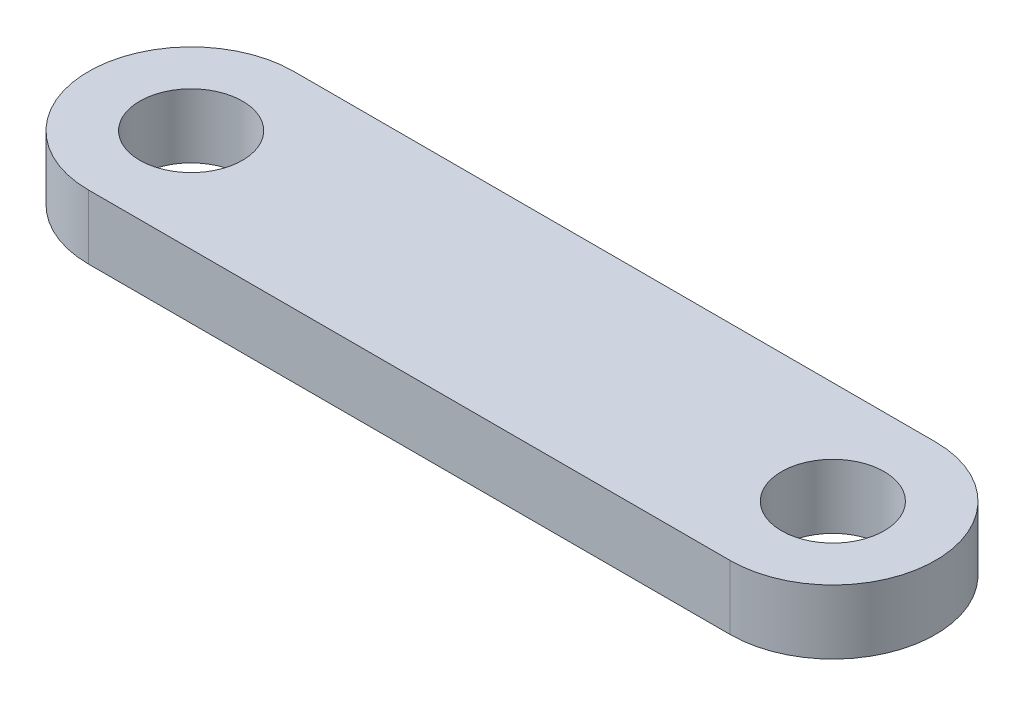
ISO-10303-21;
HEADER;
FILE_DESCRIPTION(('STEP AP214'),'2;1');
FILE_NAME('part.step','',(''),(''),'','','');
FILE_SCHEMA(('AUTOMOTIVE_DESIGN { 1 0 10303 214 1 1 1 1 }'));
ENDSEC;
DATA;
#1=APPLICATION_CONTEXT('core data for automotive mechanical design processes');
#2=APPLICATION_PROTOCOL_DEFINITION('international standard','automotive_design',2000,#1);
#3=PRODUCT_CONTEXT('',#1,'mechanical');
#4=PRODUCT('Part','Part','',(#3));
#5=PRODUCT_RELATED_PRODUCT_CATEGORY('part','',(#4));
#6=PRODUCT_DEFINITION_FORMATION('','',#4);
#7=PRODUCT_DEFINITION_CONTEXT('part definition',#1,'design');
#8=PRODUCT_DEFINITION('design','',#6,#7);
#9=PRODUCT_DEFINITION_SHAPE('','',#8);
#10=(LENGTH_UNIT() NAMED_UNIT(*) SI_UNIT(.MILLI.,.METRE.));
#11=(NAMED_UNIT(*) PLANE_ANGLE_UNIT() SI_UNIT($,.RADIAN.));
#12=(NAMED_UNIT(*) SI_UNIT($,.STERADIAN.) SOLID_ANGLE_UNIT());
#13=UNCERTAINTY_MEASURE_WITH_UNIT(LENGTH_MEASURE(1.E-05),#10,'distance_accuracy_value','');
#14=(GEOMETRIC_REPRESENTATION_CONTEXT(3) GLOBAL_UNCERTAINTY_ASSIGNED_CONTEXT((#13)) GLOBAL_UNIT_ASSIGNED_CONTEXT((#10,
#11,#12)) REPRESENTATION_CONTEXT('',''));
#15=CARTESIAN_POINT('',(0.,0.,0.));
#16=DIRECTION('',(0.,0.,1.));
#17=DIRECTION('',(1.,0.,0.));
#18=AXIS2_PLACEMENT_3D('',#15,#16,#17);
#19=CARTESIAN_POINT('',(25.,5.,0.));
#20=DIRECTION('',(0.,-1.,0.));
#21=DIRECTION('',(0.,0.,-1.));
#22=AXIS2_PLACEMENT_3D('',#19,#20,#21);
#23=PLANE('',#22);
#24=CARTESIAN_POINT('',(25.,5.,0.));
#25=DIRECTION('',(0.,1.,0.));
#26=DIRECTION('',(0.,0.,-1.));
#27=AXIS2_PLACEMENT_3D('',#24,#25,#26);
#28=CIRCLE('',#27,8.);
#29=CARTESIAN_POINT('',(25.,5.,8.));
#30=VERTEX_POINT('',#29);
#31=CARTESIAN_POINT('',(25.,5.,-8.));
#32=VERTEX_POINT('',#31);
#33=EDGE_CURVE('E84',#30,#32,#28,.T.);
#34=ORIENTED_EDGE('',*,*,#33,.T.);
#35=DIRECTION('',(-1.,0.,0.));
#36=VECTOR('',#35,1.);
#37=CARTESIAN_POINT('',(-25.,5.,-8.));
#38=LINE('',#37,#36);
#39=CARTESIAN_POINT('',(-25.,5.,-8.));
#40=VERTEX_POINT('',#39);
#41=EDGE_CURVE('E79',#32,#40,#38,.T.);
#42=ORIENTED_EDGE('',*,*,#41,.T.);
#43=CARTESIAN_POINT('',(-25.,5.,0.));
#44=DIRECTION('',(0.,1.,0.));
#45=DIRECTION('',(0.,0.,1.));
#46=AXIS2_PLACEMENT_3D('',#43,#44,#45);
#47=CIRCLE('',#46,8.);
#48=CARTESIAN_POINT('',(-25.,5.,8.));
#49=VERTEX_POINT('',#48);
#50=EDGE_CURVE('E82',#40,#49,#47,.T.);
#51=ORIENTED_EDGE('',*,*,#50,.T.);
#52=DIRECTION('',(1.,0.,0.));
#53=VECTOR('',#52,1.);
#54=CARTESIAN_POINT('',(-25.,5.,8.));
#55=LINE('',#54,#53);
#56=EDGE_CURVE('E49',#49,#30,#55,.T.);
#57=ORIENTED_EDGE('',*,*,#56,.T.);
#58=EDGE_LOOP('',(#34,#42,#51,#57));
#59=FACE_BOUND('',#58,.T.);
#60=CARTESIAN_POINT('',(-25.,5.,0.));
#61=DIRECTION('',(0.,1.,0.));
#62=DIRECTION('',(0.,0.,1.));
#63=AXIS2_PLACEMENT_3D('',#60,#61,#62);
#64=CIRCLE('',#63,4.);
#65=CARTESIAN_POINT('',(-25.,5.,4.));
#66=VERTEX_POINT('',#65);
#67=EDGE_CURVE('E99',#66,#66,#64,.T.);
#68=ORIENTED_EDGE('',*,*,#67,.F.);
#69=EDGE_LOOP('',(#68));
#70=FACE_BOUND('',#69,.T.);
#71=CARTESIAN_POINT('',(25.,5.,0.));
#72=DIRECTION('',(0.,1.,0.));
#73=DIRECTION('',(0.,0.,1.));
#74=AXIS2_PLACEMENT_3D('',#71,#72,#73);
#75=CIRCLE('',#74,4.);
#76=CARTESIAN_POINT('',(25.,5.,4.));
#77=VERTEX_POINT('',#76);
#78=EDGE_CURVE('E114',#77,#77,#75,.T.);
#79=ORIENTED_EDGE('',*,*,#78,.F.);
#80=EDGE_LOOP('',(#79));
#81=FACE_BOUND('',#80,.T.);
#82=ADVANCED_FACE('F32',(#59,#70,#81),#23,.F.);
#83=CARTESIAN_POINT('',(25.,0.,0.));
#84=DIRECTION('',(0.,-1.,0.));
#85=DIRECTION('',(0.,0.,-1.));
#86=AXIS2_PLACEMENT_3D('',#83,#84,#85);
#87=PLANE('',#86);
#88=CARTESIAN_POINT('',(-25.,0.,0.));
#89=DIRECTION('',(0.,1.,0.));
#90=DIRECTION('',(0.,0.,1.));
#91=AXIS2_PLACEMENT_3D('',#88,#89,#90);
#92=CIRCLE('',#91,4.);
#93=CARTESIAN_POINT('',(-25.,0.,4.));
#94=VERTEX_POINT('',#93);
#95=EDGE_CURVE('E111',#94,#94,#92,.T.);
#96=ORIENTED_EDGE('',*,*,#95,.T.);
#97=EDGE_LOOP('',(#96));
#98=FACE_BOUND('',#97,.T.);
#99=CARTESIAN_POINT('',(25.,0.,0.));
#100=DIRECTION('',(0.,1.,0.));
#101=DIRECTION('',(0.,0.,-1.));
#102=AXIS2_PLACEMENT_3D('',#99,#100,#101);
#103=CIRCLE('',#102,8.);
#104=CARTESIAN_POINT('',(25.,0.,8.));
#105=VERTEX_POINT('',#104);
#106=CARTESIAN_POINT('',(25.,0.,-8.));
#107=VERTEX_POINT('',#106);
#108=EDGE_CURVE('E96',#105,#107,#103,.T.);
#109=ORIENTED_EDGE('',*,*,#108,.F.);
#110=DIRECTION('',(1.,0.,0.));
#111=VECTOR('',#110,1.);
#112=CARTESIAN_POINT('',(-25.,0.,8.));
#113=LINE('',#112,#111);
#114=CARTESIAN_POINT('',(-25.,0.,8.));
#115=VERTEX_POINT('',#114);
#116=EDGE_CURVE('E72',#115,#105,#113,.T.);
#117=ORIENTED_EDGE('',*,*,#116,.F.);
#118=CARTESIAN_POINT('',(-25.,0.,0.));
#119=DIRECTION('',(0.,1.,0.));
#120=DIRECTION('',(0.,0.,1.));
#121=AXIS2_PLACEMENT_3D('',#118,#119,#120);
#122=CIRCLE('',#121,8.);
#123=CARTESIAN_POINT('',(-25.,0.,-8.));
#124=VERTEX_POINT('',#123);
#125=EDGE_CURVE('E66',#124,#115,#122,.T.);
#126=ORIENTED_EDGE('',*,*,#125,.F.);
#127=DIRECTION('',(-1.,0.,0.));
#128=VECTOR('',#127,1.);
#129=CARTESIAN_POINT('',(-25.,0.,-8.));
#130=LINE('',#129,#128);
#131=EDGE_CURVE('E88',#107,#124,#130,.T.);
#132=ORIENTED_EDGE('',*,*,#131,.F.);
#133=EDGE_LOOP('',(#109,#117,#126,#132));
#134=FACE_BOUND('',#133,.T.);
#135=CARTESIAN_POINT('',(25.,0.,0.));
#136=DIRECTION('',(0.,1.,0.));
#137=DIRECTION('',(0.,0.,1.));
#138=AXIS2_PLACEMENT_3D('',#135,#136,#137);
#139=CIRCLE('',#138,4.);
#140=CARTESIAN_POINT('',(25.,0.,4.));
#141=VERTEX_POINT('',#140);
#142=EDGE_CURVE('E117',#141,#141,#139,.T.);
#143=ORIENTED_EDGE('',*,*,#142,.T.);
#144=EDGE_LOOP('',(#143));
#145=FACE_BOUND('',#144,.T.);
#146=ADVANCED_FACE('F107',(#98,#134,#145),#87,.T.);
#147=CARTESIAN_POINT('',(25.,5.,0.));
#148=DIRECTION('',(0.,-1.,0.));
#149=DIRECTION('',(0.,0.,-1.));
#150=AXIS2_PLACEMENT_3D('',#147,#148,#149);
#151=CYLINDRICAL_SURFACE('',#150,8.);
#152=ORIENTED_EDGE('',*,*,#108,.T.);
#153=DIRECTION('',(0.,-1.,0.));
#154=VECTOR('',#153,1.);
#155=CARTESIAN_POINT('',(25.,5.,-8.));
#156=LINE('',#155,#154);
#157=EDGE_CURVE('E11',#32,#107,#156,.T.);
#158=ORIENTED_EDGE('',*,*,#157,.F.);
#159=ORIENTED_EDGE('',*,*,#33,.F.);
#160=DIRECTION('',(0.,-1.,0.));
#161=VECTOR('',#160,1.);
#162=CARTESIAN_POINT('',(25.,5.,8.));
#163=LINE('',#162,#161);
#164=EDGE_CURVE('E92',#30,#105,#163,.T.);
#165=ORIENTED_EDGE('',*,*,#164,.T.);
#166=EDGE_LOOP('',(#152,#158,#159,#165));
#167=FACE_BOUND('',#166,.T.);
#168=ADVANCED_FACE('F34',(#167),#151,.T.);
#169=CARTESIAN_POINT('',(-25.,5.,-8.));
#170=DIRECTION('',(0.,0.,1.));
#171=DIRECTION('',(1.,0.,0.));
#172=AXIS2_PLACEMENT_3D('',#169,#170,#171);
#173=PLANE('',#172);
#174=ORIENTED_EDGE('',*,*,#131,.T.);
#175=DIRECTION('',(0.,-1.,0.));
#176=VECTOR('',#175,1.);
#177=CARTESIAN_POINT('',(-25.,5.,-8.));
#178=LINE('',#177,#176);
#179=EDGE_CURVE('E41',#40,#124,#178,.T.);
#180=ORIENTED_EDGE('',*,*,#179,.F.);
#181=ORIENTED_EDGE('',*,*,#41,.F.);
#182=ORIENTED_EDGE('',*,*,#157,.T.);
#183=EDGE_LOOP('',(#174,#180,#181,#182));
#184=FACE_BOUND('',#183,.T.);
#185=ADVANCED_FACE('F87',(#184),#173,.F.);
#186=CARTESIAN_POINT('',(-25.,5.,0.));
#187=DIRECTION('',(0.,-1.,0.));
#188=DIRECTION('',(0.,0.,-1.));
#189=AXIS2_PLACEMENT_3D('',#186,#187,#188);
#190=CYLINDRICAL_SURFACE('',#189,8.);
#191=ORIENTED_EDGE('',*,*,#125,.T.);
#192=DIRECTION('',(0.,-1.,0.));
#193=VECTOR('',#192,1.);
#194=CARTESIAN_POINT('',(-25.,5.,8.));
#195=LINE('',#194,#193);
#196=EDGE_CURVE('E89',#49,#115,#195,.T.);
#197=ORIENTED_EDGE('',*,*,#196,.F.);
#198=ORIENTED_EDGE('',*,*,#50,.F.);
#199=ORIENTED_EDGE('',*,*,#179,.T.);
#200=EDGE_LOOP('',(#191,#197,#198,#199));
#201=FACE_BOUND('',#200,.T.);
#202=ADVANCED_FACE('F90',(#201),#190,.T.);
#203=CARTESIAN_POINT('',(-25.,5.,8.));
#204=DIRECTION('',(0.,0.,-1.));
#205=DIRECTION('',(-1.,0.,0.));
#206=AXIS2_PLACEMENT_3D('',#203,#204,#205);
#207=PLANE('',#206);
#208=ORIENTED_EDGE('',*,*,#116,.T.);
#209=ORIENTED_EDGE('',*,*,#164,.F.);
#210=ORIENTED_EDGE('',*,*,#56,.F.);
#211=ORIENTED_EDGE('',*,*,#196,.T.);
#212=EDGE_LOOP('',(#208,#209,#210,#211));
#213=FACE_BOUND('',#212,.T.);
#214=ADVANCED_FACE('F104',(#213),#207,.F.);
#215=CARTESIAN_POINT('',(-25.,5.,0.));
#216=DIRECTION('',(0.,-1.,0.));
#217=DIRECTION('',(0.,0.,-1.));
#218=AXIS2_PLACEMENT_3D('',#215,#216,#217);
#219=CYLINDRICAL_SURFACE('',#218,4.);
#220=ORIENTED_EDGE('',*,*,#67,.T.);
#221=EDGE_LOOP('',(#220));
#222=FACE_BOUND('',#221,.T.);
#223=ORIENTED_EDGE('',*,*,#95,.F.);
#224=EDGE_LOOP('',(#223));
#225=FACE_BOUND('',#224,.T.);
#226=ADVANCED_FACE('F134',(#222,#225),#219,.F.);
#227=CARTESIAN_POINT('',(25.,5.,0.));
#228=DIRECTION('',(0.,-1.,0.));
#229=DIRECTION('',(0.,0.,-1.));
#230=AXIS2_PLACEMENT_3D('',#227,#228,#229);
#231=CYLINDRICAL_SURFACE('',#230,4.);
#232=ORIENTED_EDGE('',*,*,#78,.T.);
#233=EDGE_LOOP('',(#232));
#234=FACE_BOUND('',#233,.T.);
#235=ORIENTED_EDGE('',*,*,#142,.F.);
#236=EDGE_LOOP('',(#235));
#237=FACE_BOUND('',#236,.T.);
#238=ADVANCED_FACE('F123',(#234,#237),#231,.F.);
#239=CLOSED_SHELL('',(#82,#146,#168,#185,#202,#214,#226,#238));
#240=MANIFOLD_SOLID_BREP('B2',#239);
#241=ADVANCED_BREP_SHAPE_REPRESENTATION('',(#18,#240),#14);
#242=SHAPE_DEFINITION_REPRESENTATION(#9,#241);
ENDSEC;
END-ISO-10303-21;
